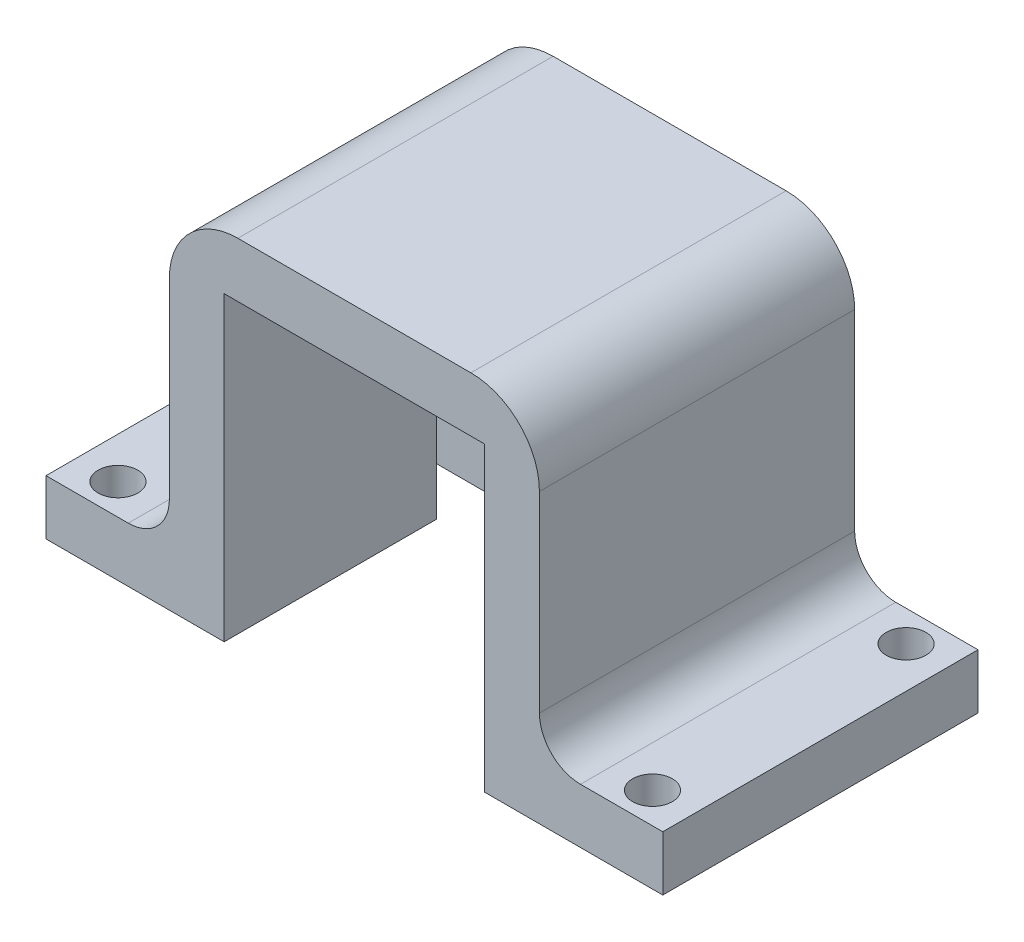
ISO-10303-21;
HEADER;
FILE_DESCRIPTION(('STEP AP214'),'2;1');
FILE_NAME('part.step','',(''),(''),'','','');
FILE_SCHEMA(('AUTOMOTIVE_DESIGN { 1 0 10303 214 1 1 1 1 }'));
ENDSEC;
DATA;
#1=APPLICATION_CONTEXT('core data for automotive mechanical design processes');
#2=APPLICATION_PROTOCOL_DEFINITION('international standard','automotive_design',2000,#1);
#3=PRODUCT_CONTEXT('',#1,'mechanical');
#4=PRODUCT('Part','Part','',(#3));
#5=PRODUCT_RELATED_PRODUCT_CATEGORY('part','',(#4));
#6=PRODUCT_DEFINITION_FORMATION('','',#4);
#7=PRODUCT_DEFINITION_CONTEXT('part definition',#1,'design');
#8=PRODUCT_DEFINITION('design','',#6,#7);
#9=PRODUCT_DEFINITION_SHAPE('','',#8);
#10=(LENGTH_UNIT() NAMED_UNIT(*) SI_UNIT(.MILLI.,.METRE.));
#11=(NAMED_UNIT(*) PLANE_ANGLE_UNIT() SI_UNIT($,.RADIAN.));
#12=(NAMED_UNIT(*) SI_UNIT($,.STERADIAN.) SOLID_ANGLE_UNIT());
#13=UNCERTAINTY_MEASURE_WITH_UNIT(LENGTH_MEASURE(1.E-05),#10,'distance_accuracy_value','');
#14=(GEOMETRIC_REPRESENTATION_CONTEXT(3) GLOBAL_UNCERTAINTY_ASSIGNED_CONTEXT((#13)) GLOBAL_UNIT_ASSIGNED_CONTEXT((#10,
#11,#12)) REPRESENTATION_CONTEXT('',''));
#15=CARTESIAN_POINT('',(0.,0.,0.));
#16=DIRECTION('',(0.,0.,1.));
#17=DIRECTION('',(1.,0.,0.));
#18=AXIS2_PLACEMENT_3D('',#15,#16,#17);
#19=CARTESIAN_POINT('',(0.,3.00000000000002,23.));
#20=DIRECTION('',(1.,0.,0.));
#21=DIRECTION('',(0.,0.,-1.));
#22=AXIS2_PLACEMENT_3D('',#19,#20,#21);
#23=PLANE('',#22);
#24=DIRECTION('',(0.,-1.,0.));
#25=VECTOR('',#24,1.);
#26=CARTESIAN_POINT('',(0.,3.00000000000002,4.));
#27=LINE('',#26,#25);
#28=CARTESIAN_POINT('',(0.,17.,4.));
#29=VERTEX_POINT('',#28);
#30=CARTESIAN_POINT('',(0.,3.00000000000002,4.));
#31=VERTEX_POINT('',#30);
#32=EDGE_CURVE('E413',#29,#31,#27,.T.);
#33=ORIENTED_EDGE('',*,*,#32,.F.);
#34=DIRECTION('',(0.,0.,-1.));
#35=VECTOR('',#34,1.);
#36=CARTESIAN_POINT('',(0.,17.,23.));
#37=LINE('',#36,#35);
#38=CARTESIAN_POINT('',(0.,17.,0.));
#39=VERTEX_POINT('',#38);
#40=EDGE_CURVE('E291',#29,#39,#37,.T.);
#41=ORIENTED_EDGE('',*,*,#40,.T.);
#42=DIRECTION('',(0.,-1.,0.));
#43=VECTOR('',#42,1.);
#44=CARTESIAN_POINT('',(0.,3.00000000000002,0.));
#45=LINE('',#44,#43);
#46=CARTESIAN_POINT('',(0.,3.00000000000002,0.));
#47=VERTEX_POINT('',#46);
#48=EDGE_CURVE('E229',#39,#47,#45,.T.);
#49=ORIENTED_EDGE('',*,*,#48,.T.);
#50=DIRECTION('',(0.,0.,-1.));
#51=VECTOR('',#50,1.);
#52=CARTESIAN_POINT('',(0.,3.00000000000002,23.));
#53=LINE('',#52,#51);
#54=EDGE_CURVE('E286',#31,#47,#53,.T.);
#55=ORIENTED_EDGE('',*,*,#54,.F.);
#56=EDGE_LOOP('',(#33,#41,#49,#55));
#57=FACE_BOUND('',#56,.T.);
#58=ADVANCED_FACE('F44',(#57),#23,.F.);
#59=DIRECTION('',(0.,1.,0.));
#60=VECTOR('',#59,1.);
#61=CARTESIAN_POINT('',(0.,3.00000000000002,7.5));
#62=LINE('',#61,#60);
#63=CARTESIAN_POINT('',(0.,3.00000000000002,7.5));
#64=VERTEX_POINT('',#63);
#65=CARTESIAN_POINT('',(0.,17.,7.5));
#66=VERTEX_POINT('',#65);
#67=EDGE_CURVE('E435',#64,#66,#62,.T.);
#68=ORIENTED_EDGE('',*,*,#67,.F.);
#69=CARTESIAN_POINT('',(0.,3.00000000000002,23.));
#70=VERTEX_POINT('',#69);
#71=EDGE_CURVE('E287',#70,#64,#53,.T.);
#72=ORIENTED_EDGE('',*,*,#71,.F.);
#73=DIRECTION('',(0.,-1.,0.));
#74=VECTOR('',#73,1.);
#75=CARTESIAN_POINT('',(0.,3.00000000000002,23.));
#76=LINE('',#75,#74);
#77=CARTESIAN_POINT('',(0.,17.,23.));
#78=VERTEX_POINT('',#77);
#79=EDGE_CURVE('E382',#78,#70,#76,.T.);
#80=ORIENTED_EDGE('',*,*,#79,.F.);
#81=EDGE_CURVE('E292',#78,#66,#37,.T.);
#82=ORIENTED_EDGE('',*,*,#81,.T.);
#83=EDGE_LOOP('',(#68,#72,#80,#82));
#84=FACE_BOUND('',#83,.T.);
#85=ADVANCED_FACE('F522',(#84),#23,.F.);
#86=CARTESIAN_POINT('',(-3.,3.,23.));
#87=DIRECTION('',(0.,0.,-1.));
#88=DIRECTION('',(-1.,0.,0.));
#89=AXIS2_PLACEMENT_3D('',#86,#87,#88);
#90=CYLINDRICAL_SURFACE('',#89,3.);
#91=CARTESIAN_POINT('',(-3.,3.,4.));
#92=DIRECTION('',(0.,0.,1.));
#93=DIRECTION('',(0.,-1.,0.));
#94=AXIS2_PLACEMENT_3D('',#91,#92,#93);
#95=CIRCLE('',#94,3.);
#96=CARTESIAN_POINT('',(-3.00000000000002,0.,4.));
#97=VERTEX_POINT('',#96);
#98=EDGE_CURVE('E423',#31,#97,#95,.F.);
#99=ORIENTED_EDGE('',*,*,#98,.F.);
#100=ORIENTED_EDGE('',*,*,#54,.T.);
#101=CARTESIAN_POINT('',(-3.,3.,0.));
#102=DIRECTION('',(0.,0.,-1.));
#103=DIRECTION('',(-1.,0.,0.));
#104=AXIS2_PLACEMENT_3D('',#101,#102,#103);
#105=CIRCLE('',#104,3.);
#106=CARTESIAN_POINT('',(-3.00000000000002,0.,0.));
#107=VERTEX_POINT('',#106);
#108=EDGE_CURVE('E233',#47,#107,#105,.T.);
#109=ORIENTED_EDGE('',*,*,#108,.T.);
#110=DIRECTION('',(0.,0.,-1.));
#111=VECTOR('',#110,1.);
#112=CARTESIAN_POINT('',(-3.00000000000002,0.,23.));
#113=LINE('',#112,#111);
#114=EDGE_CURVE('E281',#97,#107,#113,.T.);
#115=ORIENTED_EDGE('',*,*,#114,.F.);
#116=EDGE_LOOP('',(#99,#100,#109,#115));
#117=FACE_BOUND('',#116,.T.);
#118=ADVANCED_FACE('F500',(#117),#90,.F.);
#119=CARTESIAN_POINT('',(-3.,3.,7.5));
#120=DIRECTION('',(0.,0.,-1.));
#121=DIRECTION('',(0.,1.,0.));
#122=AXIS2_PLACEMENT_3D('',#119,#120,#121);
#123=CIRCLE('',#122,3.);
#124=CARTESIAN_POINT('',(-3.00000000000002,0.,7.5));
#125=VERTEX_POINT('',#124);
#126=EDGE_CURVE('E438',#125,#64,#123,.F.);
#127=ORIENTED_EDGE('',*,*,#126,.F.);
#128=CARTESIAN_POINT('',(-3.00000000000002,0.,23.));
#129=VERTEX_POINT('',#128);
#130=EDGE_CURVE('E282',#129,#125,#113,.T.);
#131=ORIENTED_EDGE('',*,*,#130,.F.);
#132=CARTESIAN_POINT('',(-3.,3.,23.));
#133=DIRECTION('',(0.,0.,-1.));
#134=DIRECTION('',(-1.,0.,0.));
#135=AXIS2_PLACEMENT_3D('',#132,#133,#134);
#136=CIRCLE('',#135,3.);
#137=EDGE_CURVE('E379',#70,#129,#136,.T.);
#138=ORIENTED_EDGE('',*,*,#137,.F.);
#139=ORIENTED_EDGE('',*,*,#71,.T.);
#140=EDGE_LOOP('',(#127,#131,#138,#139));
#141=FACE_BOUND('',#140,.T.);
#142=ADVANCED_FACE('F555',(#141),#90,.F.);
#143=CARTESIAN_POINT('',(-9.,0.,23.));
#144=DIRECTION('',(0.,-1.,0.));
#145=DIRECTION('',(0.,0.,-1.));
#146=AXIS2_PLACEMENT_3D('',#143,#144,#145);
#147=PLANE('',#146);
#148=CARTESIAN_POINT('',(-6.00000000000001,0.,2.25));
#149=DIRECTION('',(0.,1.,0.));
#150=DIRECTION('',(0.,0.,1.));
#151=AXIS2_PLACEMENT_3D('',#148,#149,#150);
#152=CIRCLE('',#151,1.45);
#153=CARTESIAN_POINT('',(-6.00000000000001,0.,3.7));
#154=VERTEX_POINT('',#153);
#155=EDGE_CURVE('E408',#154,#154,#152,.T.);
#156=ORIENTED_EDGE('',*,*,#155,.F.);
#157=EDGE_LOOP('',(#156));
#158=FACE_BOUND('',#157,.T.);
#159=DIRECTION('',(-1.,0.,0.));
#160=VECTOR('',#159,1.);
#161=CARTESIAN_POINT('',(-9.,0.,4.));
#162=LINE('',#161,#160);
#163=CARTESIAN_POINT('',(-9.,0.,4.));
#164=VERTEX_POINT('',#163);
#165=EDGE_CURVE('E427',#97,#164,#162,.T.);
#166=ORIENTED_EDGE('',*,*,#165,.F.);
#167=ORIENTED_EDGE('',*,*,#114,.T.);
#168=DIRECTION('',(-1.,0.,0.));
#169=VECTOR('',#168,1.);
#170=CARTESIAN_POINT('',(-9.,0.,0.));
#171=LINE('',#170,#169);
#172=CARTESIAN_POINT('',(-9.,0.,0.));
#173=VERTEX_POINT('',#172);
#174=EDGE_CURVE('E237',#107,#173,#171,.T.);
#175=ORIENTED_EDGE('',*,*,#174,.T.);
#176=DIRECTION('',(0.,0.,-1.));
#177=VECTOR('',#176,1.);
#178=CARTESIAN_POINT('',(-9.,0.,23.));
#179=LINE('',#178,#177);
#180=EDGE_CURVE('E276',#164,#173,#179,.T.);
#181=ORIENTED_EDGE('',*,*,#180,.F.);
#182=EDGE_LOOP('',(#166,#167,#175,#181));
#183=FACE_BOUND('',#182,.T.);
#184=ADVANCED_FACE('F552',(#158,#183),#147,.F.);
#185=CARTESIAN_POINT('',(-6.00000000000001,0.,20.75));
#186=DIRECTION('',(0.,1.,0.));
#187=DIRECTION('',(0.,0.,1.));
#188=AXIS2_PLACEMENT_3D('',#185,#186,#187);
#189=CIRCLE('',#188,1.45);
#190=CARTESIAN_POINT('',(-6.00000000000001,0.,22.2));
#191=VERTEX_POINT('',#190);
#192=EDGE_CURVE('E412',#191,#191,#189,.T.);
#193=ORIENTED_EDGE('',*,*,#192,.F.);
#194=EDGE_LOOP('',(#193));
#195=FACE_BOUND('',#194,.T.);
#196=DIRECTION('',(1.,0.,0.));
#197=VECTOR('',#196,1.);
#198=CARTESIAN_POINT('',(-9.,0.,7.5));
#199=LINE('',#198,#197);
#200=CARTESIAN_POINT('',(-9.,0.,7.5));
#201=VERTEX_POINT('',#200);
#202=EDGE_CURVE('E442',#201,#125,#199,.T.);
#203=ORIENTED_EDGE('',*,*,#202,.F.);
#204=CARTESIAN_POINT('',(-9.,0.,23.));
#205=VERTEX_POINT('',#204);
#206=EDGE_CURVE('E277',#205,#201,#179,.T.);
#207=ORIENTED_EDGE('',*,*,#206,.F.);
#208=DIRECTION('',(-1.,0.,0.));
#209=VECTOR('',#208,1.);
#210=CARTESIAN_POINT('',(-9.,0.,23.));
#211=LINE('',#210,#209);
#212=EDGE_CURVE('E376',#129,#205,#211,.T.);
#213=ORIENTED_EDGE('',*,*,#212,.F.);
#214=ORIENTED_EDGE('',*,*,#130,.T.);
#215=EDGE_LOOP('',(#203,#207,#213,#214));
#216=FACE_BOUND('',#215,.T.);
#217=ADVANCED_FACE('F554',(#195,#216),#147,.F.);
#218=CARTESIAN_POINT('',(-9.,-4.,23.));
#219=DIRECTION('',(1.,0.,0.));
#220=DIRECTION('',(0.,1.,0.));
#221=AXIS2_PLACEMENT_3D('',#218,#219,#220);
#222=PLANE('',#221);
#223=DIRECTION('',(0.,-1.,0.));
#224=VECTOR('',#223,1.);
#225=CARTESIAN_POINT('',(-9.,-4.,4.));
#226=LINE('',#225,#224);
#227=CARTESIAN_POINT('',(-9.,-4.,4.));
#228=VERTEX_POINT('',#227);
#229=EDGE_CURVE('E431',#164,#228,#226,.T.);
#230=ORIENTED_EDGE('',*,*,#229,.F.);
#231=ORIENTED_EDGE('',*,*,#180,.T.);
#232=DIRECTION('',(0.,-1.,0.));
#233=VECTOR('',#232,1.);
#234=CARTESIAN_POINT('',(-9.,-4.,0.));
#235=LINE('',#234,#233);
#236=CARTESIAN_POINT('',(-9.,-4.,0.));
#237=VERTEX_POINT('',#236);
#238=EDGE_CURVE('E241',#173,#237,#235,.T.);
#239=ORIENTED_EDGE('',*,*,#238,.T.);
#240=DIRECTION('',(0.,0.,-1.));
#241=VECTOR('',#240,1.);
#242=CARTESIAN_POINT('',(-9.,-4.,23.));
#243=LINE('',#242,#241);
#244=EDGE_CURVE('E271',#228,#237,#243,.T.);
#245=ORIENTED_EDGE('',*,*,#244,.F.);
#246=EDGE_LOOP('',(#230,#231,#239,#245));
#247=FACE_BOUND('',#246,.T.);
#248=ADVANCED_FACE('F549',(#247),#222,.F.);
#249=DIRECTION('',(0.,1.,0.));
#250=VECTOR('',#249,1.);
#251=CARTESIAN_POINT('',(-9.,-4.,7.5));
#252=LINE('',#251,#250);
#253=CARTESIAN_POINT('',(-9.,-4.,7.5));
#254=VERTEX_POINT('',#253);
#255=EDGE_CURVE('E446',#254,#201,#252,.T.);
#256=ORIENTED_EDGE('',*,*,#255,.F.);
#257=CARTESIAN_POINT('',(-9.,-4.,23.));
#258=VERTEX_POINT('',#257);
#259=EDGE_CURVE('E272',#258,#254,#243,.T.);
#260=ORIENTED_EDGE('',*,*,#259,.F.);
#261=DIRECTION('',(0.,-1.,0.));
#262=VECTOR('',#261,1.);
#263=CARTESIAN_POINT('',(-9.,-4.,23.));
#264=LINE('',#263,#262);
#265=EDGE_CURVE('E371',#205,#258,#264,.T.);
#266=ORIENTED_EDGE('',*,*,#265,.F.);
#267=ORIENTED_EDGE('',*,*,#206,.T.);
#268=EDGE_LOOP('',(#256,#260,#266,#267));
#269=FACE_BOUND('',#268,.T.);
#270=ADVANCED_FACE('F617',(#269),#222,.F.);
#271=CARTESIAN_POINT('',(4.,-4.,23.));
#272=DIRECTION('',(0.,1.,0.));
#273=DIRECTION('',(-1.,0.,0.));
#274=AXIS2_PLACEMENT_3D('',#271,#272,#273);
#275=PLANE('',#274);
#276=CARTESIAN_POINT('',(-6.00000000000001,-4.,2.25));
#277=DIRECTION('',(0.,1.,0.));
#278=DIRECTION('',(-1.,0.,0.));
#279=AXIS2_PLACEMENT_3D('',#276,#277,#278);
#280=CIRCLE('',#279,1.45);
#281=CARTESIAN_POINT('',(-7.45000000000001,-4.,2.25));
#282=VERTEX_POINT('',#281);
#283=EDGE_CURVE('E210',#282,#282,#280,.T.);
#284=ORIENTED_EDGE('',*,*,#283,.T.);
#285=EDGE_LOOP('',(#284));
#286=FACE_BOUND('',#285,.T.);
#287=DIRECTION('',(1.,0.,0.));
#288=VECTOR('',#287,1.);
#289=CARTESIAN_POINT('',(-23.,-4.,4.));
#290=LINE('',#289,#288);
#291=CARTESIAN_POINT('',(4.,-4.,4.));
#292=VERTEX_POINT('',#291);
#293=EDGE_CURVE('E364',#228,#292,#290,.T.);
#294=ORIENTED_EDGE('',*,*,#293,.F.);
#295=ORIENTED_EDGE('',*,*,#244,.T.);
#296=DIRECTION('',(1.,0.,0.));
#297=VECTOR('',#296,1.);
#298=CARTESIAN_POINT('',(4.,-4.,0.));
#299=LINE('',#298,#297);
#300=CARTESIAN_POINT('',(4.,-4.,0.));
#301=VERTEX_POINT('',#300);
#302=EDGE_CURVE('E245',#237,#301,#299,.T.);
#303=ORIENTED_EDGE('',*,*,#302,.T.);
#304=DIRECTION('',(0.,0.,-1.));
#305=VECTOR('',#304,1.);
#306=CARTESIAN_POINT('',(4.,-4.,23.));
#307=LINE('',#306,#305);
#308=EDGE_CURVE('E266',#292,#301,#307,.T.);
#309=ORIENTED_EDGE('',*,*,#308,.F.);
#310=EDGE_LOOP('',(#294,#295,#303,#309));
#311=FACE_BOUND('',#310,.T.);
#312=ADVANCED_FACE('F469',(#286,#311),#275,.F.);
#313=CARTESIAN_POINT('',(-6.00000000000001,-4.,20.75));
#314=DIRECTION('',(0.,1.,0.));
#315=DIRECTION('',(-1.,0.,0.));
#316=AXIS2_PLACEMENT_3D('',#313,#314,#315);
#317=CIRCLE('',#316,1.45);
#318=CARTESIAN_POINT('',(-7.45000000000001,-4.,20.75));
#319=VERTEX_POINT('',#318);
#320=EDGE_CURVE('E329',#319,#319,#317,.T.);
#321=ORIENTED_EDGE('',*,*,#320,.T.);
#322=EDGE_LOOP('',(#321));
#323=FACE_BOUND('',#322,.T.);
#324=DIRECTION('',(1.,0.,0.));
#325=VECTOR('',#324,1.);
#326=CARTESIAN_POINT('',(-23.,-4.,7.5));
#327=LINE('',#326,#325);
#328=CARTESIAN_POINT('',(4.,-4.,7.5));
#329=VERTEX_POINT('',#328);
#330=EDGE_CURVE('E349',#254,#329,#327,.T.);
#331=ORIENTED_EDGE('',*,*,#330,.T.);
#332=CARTESIAN_POINT('',(4.,-4.,23.));
#333=VERTEX_POINT('',#332);
#334=EDGE_CURVE('E267',#333,#329,#307,.T.);
#335=ORIENTED_EDGE('',*,*,#334,.F.);
#336=DIRECTION('',(1.,0.,0.));
#337=VECTOR('',#336,1.);
#338=CARTESIAN_POINT('',(4.,-4.,23.));
#339=LINE('',#338,#337);
#340=EDGE_CURVE('E369',#258,#333,#339,.T.);
#341=ORIENTED_EDGE('',*,*,#340,.F.);
#342=ORIENTED_EDGE('',*,*,#259,.T.);
#343=EDGE_LOOP('',(#331,#335,#341,#342));
#344=FACE_BOUND('',#343,.T.);
#345=ADVANCED_FACE('F360',(#323,#344),#275,.F.);
#346=CARTESIAN_POINT('',(4.,18.,23.));
#347=DIRECTION('',(-1.,0.,0.));
#348=DIRECTION('',(0.,-1.,0.));
#349=AXIS2_PLACEMENT_3D('',#346,#347,#348);
#350=PLANE('',#349);
#351=DIRECTION('',(0.,1.,0.));
#352=VECTOR('',#351,1.);
#353=CARTESIAN_POINT('',(4.,18.,4.));
#354=LINE('',#353,#352);
#355=CARTESIAN_POINT('',(4.,17.,4.));
#356=VERTEX_POINT('',#355);
#357=EDGE_CURVE('E11',#292,#356,#354,.T.);
#358=ORIENTED_EDGE('',*,*,#357,.F.);
#359=ORIENTED_EDGE('',*,*,#308,.T.);
#360=DIRECTION('',(0.,1.,0.));
#361=VECTOR('',#360,1.);
#362=CARTESIAN_POINT('',(4.,18.,0.));
#363=LINE('',#362,#361);
#364=CARTESIAN_POINT('',(4.,18.,0.));
#365=VERTEX_POINT('',#364);
#366=EDGE_CURVE('E249',#301,#365,#363,.T.);
#367=ORIENTED_EDGE('',*,*,#366,.T.);
#368=DIRECTION('',(0.,0.,-1.));
#369=VECTOR('',#368,1.);
#370=CARTESIAN_POINT('',(4.,18.,23.));
#371=LINE('',#370,#369);
#372=CARTESIAN_POINT('',(4.,18.,23.));
#373=VERTEX_POINT('',#372);
#374=EDGE_CURVE('E194',#373,#365,#371,.T.);
#375=ORIENTED_EDGE('',*,*,#374,.F.);
#376=DIRECTION('',(0.,1.,0.));
#377=VECTOR('',#376,1.);
#378=CARTESIAN_POINT('',(4.,18.,23.));
#379=LINE('',#378,#377);
#380=EDGE_CURVE('E180',#333,#373,#379,.T.);
#381=ORIENTED_EDGE('',*,*,#380,.F.);
#382=ORIENTED_EDGE('',*,*,#334,.T.);
#383=DIRECTION('',(0.,-1.,0.));
#384=VECTOR('',#383,1.);
#385=CARTESIAN_POINT('',(4.,18.,7.5));
#386=LINE('',#385,#384);
#387=CARTESIAN_POINT('',(4.,17.,7.5));
#388=VERTEX_POINT('',#387);
#389=EDGE_CURVE('E53',#388,#329,#386,.T.);
#390=ORIENTED_EDGE('',*,*,#389,.F.);
#391=DIRECTION('',(0.,0.,1.));
#392=VECTOR('',#391,1.);
#393=CARTESIAN_POINT('',(4.,17.,23.));
#394=LINE('',#393,#392);
#395=EDGE_CURVE('E319',#356,#388,#394,.T.);
#396=ORIENTED_EDGE('',*,*,#395,.F.);
#397=EDGE_LOOP('',(#358,#359,#367,#375,#381,#382,#390,#396));
#398=FACE_BOUND('',#397,.T.);
#399=ADVANCED_FACE('F367',(#398),#350,.F.);
#400=CARTESIAN_POINT('',(36.,0.,23.));
#401=DIRECTION('',(-1.,0.,0.));
#402=DIRECTION('',(0.,0.,1.));
#403=AXIS2_PLACEMENT_3D('',#400,#401,#402);
#404=PLANE('',#403);
#405=DIRECTION('',(0.,1.,0.));
#406=VECTOR('',#405,1.);
#407=CARTESIAN_POINT('',(36.,0.,0.));
#408=LINE('',#407,#406);
#409=CARTESIAN_POINT('',(36.,-4.,0.));
#410=VERTEX_POINT('',#409);
#411=CARTESIAN_POINT('',(36.,0.,0.));
#412=VERTEX_POINT('',#411);
#413=EDGE_CURVE('E205',#410,#412,#408,.T.);
#414=ORIENTED_EDGE('',*,*,#413,.T.);
#415=DIRECTION('',(0.,0.,-1.));
#416=VECTOR('',#415,1.);
#417=CARTESIAN_POINT('',(36.,0.,23.));
#418=LINE('',#417,#416);
#419=CARTESIAN_POINT('',(36.,0.,23.));
#420=VERTEX_POINT('',#419);
#421=EDGE_CURVE('E316',#420,#412,#418,.T.);
#422=ORIENTED_EDGE('',*,*,#421,.F.);
#423=DIRECTION('',(0.,1.,0.));
#424=VECTOR('',#423,1.);
#425=CARTESIAN_POINT('',(36.,0.,23.));
#426=LINE('',#425,#424);
#427=CARTESIAN_POINT('',(36.,-4.,23.));
#428=VERTEX_POINT('',#427);
#429=EDGE_CURVE('E259',#428,#420,#426,.T.);
#430=ORIENTED_EDGE('',*,*,#429,.F.);
#431=DIRECTION('',(0.,0.,-1.));
#432=VECTOR('',#431,1.);
#433=CARTESIAN_POINT('',(36.,-4.,23.));
#434=LINE('',#433,#432);
#435=EDGE_CURVE('E201',#428,#410,#434,.T.);
#436=ORIENTED_EDGE('',*,*,#435,.T.);
#437=EDGE_LOOP('',(#414,#422,#430,#436));
#438=FACE_BOUND('',#437,.T.);
#439=ADVANCED_FACE('F46',(#438),#404,.F.);
#440=CARTESIAN_POINT('',(30.,0.,23.));
#441=DIRECTION('',(0.,-1.,0.));
#442=DIRECTION('',(0.,0.,-1.));
#443=AXIS2_PLACEMENT_3D('',#440,#441,#442);
#444=PLANE('',#443);
#445=CARTESIAN_POINT('',(33.,0.,20.75));
#446=DIRECTION('',(0.,-1.,0.));
#447=DIRECTION('',(0.,0.,-1.));
#448=AXIS2_PLACEMENT_3D('',#445,#446,#447);
#449=CIRCLE('',#448,1.45);
#450=CARTESIAN_POINT('',(33.,0.,19.3));
#451=VERTEX_POINT('',#450);
#452=EDGE_CURVE('E407',#451,#451,#449,.T.);
#453=ORIENTED_EDGE('',*,*,#452,.T.);
#454=EDGE_LOOP('',(#453));
#455=FACE_BOUND('',#454,.T.);
#456=CARTESIAN_POINT('',(33.,0.,2.25));
#457=DIRECTION('',(0.,-1.,0.));
#458=DIRECTION('',(0.,0.,-1.));
#459=AXIS2_PLACEMENT_3D('',#456,#457,#458);
#460=CIRCLE('',#459,1.45);
#461=CARTESIAN_POINT('',(33.,0.,0.799999999999999));
#462=VERTEX_POINT('',#461);
#463=EDGE_CURVE('E325',#462,#462,#460,.T.);
#464=ORIENTED_EDGE('',*,*,#463,.T.);
#465=EDGE_LOOP('',(#464));
#466=FACE_BOUND('',#465,.T.);
#467=DIRECTION('',(-1.,0.,0.));
#468=VECTOR('',#467,1.);
#469=CARTESIAN_POINT('',(30.,0.,0.));
#470=LINE('',#469,#468);
#471=CARTESIAN_POINT('',(30.,0.,0.));
#472=VERTEX_POINT('',#471);
#473=EDGE_CURVE('E209',#412,#472,#470,.T.);
#474=ORIENTED_EDGE('',*,*,#473,.T.);
#475=DIRECTION('',(0.,0.,-1.));
#476=VECTOR('',#475,1.);
#477=CARTESIAN_POINT('',(30.,0.,23.));
#478=LINE('',#477,#476);
#479=CARTESIAN_POINT('',(30.,0.,23.));
#480=VERTEX_POINT('',#479);
#481=EDGE_CURVE('E312',#480,#472,#478,.T.);
#482=ORIENTED_EDGE('',*,*,#481,.F.);
#483=DIRECTION('',(-1.,0.,0.));
#484=VECTOR('',#483,1.);
#485=CARTESIAN_POINT('',(30.,0.,23.));
#486=LINE('',#485,#484);
#487=EDGE_CURVE('E134',#420,#480,#486,.T.);
#488=ORIENTED_EDGE('',*,*,#487,.F.);
#489=ORIENTED_EDGE('',*,*,#421,.T.);
#490=EDGE_LOOP('',(#474,#482,#488,#489));
#491=FACE_BOUND('',#490,.T.);
#492=ADVANCED_FACE('F544',(#455,#466,#491),#444,.F.);
#493=CARTESIAN_POINT('',(30.,3.,23.));
#494=DIRECTION('',(0.,0.,-1.));
#495=DIRECTION('',(-1.,0.,0.));
#496=AXIS2_PLACEMENT_3D('',#493,#494,#495);
#497=CYLINDRICAL_SURFACE('',#496,3.);
#498=CARTESIAN_POINT('',(30.,3.,0.));
#499=DIRECTION('',(0.,0.,-1.));
#500=DIRECTION('',(-1.,0.,0.));
#501=AXIS2_PLACEMENT_3D('',#498,#499,#500);
#502=CIRCLE('',#501,3.);
#503=CARTESIAN_POINT('',(27.,3.,0.));
#504=VERTEX_POINT('',#503);
#505=EDGE_CURVE('E213',#472,#504,#502,.T.);
#506=ORIENTED_EDGE('',*,*,#505,.T.);
#507=DIRECTION('',(0.,0.,-1.));
#508=VECTOR('',#507,1.);
#509=CARTESIAN_POINT('',(27.,3.,23.));
#510=LINE('',#509,#508);
#511=CARTESIAN_POINT('',(27.,3.,23.));
#512=VERTEX_POINT('',#511);
#513=EDGE_CURVE('E308',#512,#504,#510,.T.);
#514=ORIENTED_EDGE('',*,*,#513,.F.);
#515=CARTESIAN_POINT('',(30.,3.,23.));
#516=DIRECTION('',(0.,0.,-1.));
#517=DIRECTION('',(-1.,0.,0.));
#518=AXIS2_PLACEMENT_3D('',#515,#516,#517);
#519=CIRCLE('',#518,3.);
#520=EDGE_CURVE('E397',#480,#512,#519,.T.);
#521=ORIENTED_EDGE('',*,*,#520,.F.);
#522=ORIENTED_EDGE('',*,*,#481,.T.);
#523=EDGE_LOOP('',(#506,#514,#521,#522));
#524=FACE_BOUND('',#523,.T.);
#525=ADVANCED_FACE('F542',(#524),#497,.F.);
#526=CARTESIAN_POINT('',(27.,17.,23.));
#527=DIRECTION('',(-1.,0.,0.));
#528=DIRECTION('',(0.,-1.,0.));
#529=AXIS2_PLACEMENT_3D('',#526,#527,#528);
#530=PLANE('',#529);
#531=DIRECTION('',(0.,1.,0.));
#532=VECTOR('',#531,1.);
#533=CARTESIAN_POINT('',(27.,17.,0.));
#534=LINE('',#533,#532);
#535=CARTESIAN_POINT('',(27.,17.,0.));
#536=VERTEX_POINT('',#535);
#537=EDGE_CURVE('E216',#504,#536,#534,.T.);
#538=ORIENTED_EDGE('',*,*,#537,.T.);
#539=DIRECTION('',(0.,0.,-1.));
#540=VECTOR('',#539,1.);
#541=CARTESIAN_POINT('',(27.,17.,23.));
#542=LINE('',#541,#540);
#543=CARTESIAN_POINT('',(27.,17.,23.));
#544=VERTEX_POINT('',#543);
#545=EDGE_CURVE('E304',#544,#536,#542,.T.);
#546=ORIENTED_EDGE('',*,*,#545,.F.);
#547=DIRECTION('',(0.,1.,0.));
#548=VECTOR('',#547,1.);
#549=CARTESIAN_POINT('',(27.,17.,23.));
#550=LINE('',#549,#548);
#551=EDGE_CURVE('E394',#512,#544,#550,.T.);
#552=ORIENTED_EDGE('',*,*,#551,.F.);
#553=ORIENTED_EDGE('',*,*,#513,.T.);
#554=EDGE_LOOP('',(#538,#546,#552,#553));
#555=FACE_BOUND('',#554,.T.);
#556=ADVANCED_FACE('F538',(#555),#530,.F.);
#557=CARTESIAN_POINT('',(22.,17.,23.));
#558=DIRECTION('',(0.,0.,-1.));
#559=DIRECTION('',(-1.,0.,0.));
#560=AXIS2_PLACEMENT_3D('',#557,#558,#559);
#561=CYLINDRICAL_SURFACE('',#560,5.);
#562=CARTESIAN_POINT('',(22.,17.,0.));
#563=DIRECTION('',(0.,0.,1.));
#564=DIRECTION('',(-1.,0.,0.));
#565=AXIS2_PLACEMENT_3D('',#562,#563,#564);
#566=CIRCLE('',#565,5.);
#567=CARTESIAN_POINT('',(22.,22.,0.));
#568=VERTEX_POINT('',#567);
#569=EDGE_CURVE('E219',#536,#568,#566,.T.);
#570=ORIENTED_EDGE('',*,*,#569,.T.);
#571=DIRECTION('',(0.,0.,-1.));
#572=VECTOR('',#571,1.);
#573=CARTESIAN_POINT('',(22.,22.,23.));
#574=LINE('',#573,#572);
#575=CARTESIAN_POINT('',(22.,22.,23.));
#576=VERTEX_POINT('',#575);
#577=EDGE_CURVE('E300',#576,#568,#574,.T.);
#578=ORIENTED_EDGE('',*,*,#577,.F.);
#579=CARTESIAN_POINT('',(22.,17.,23.));
#580=DIRECTION('',(0.,0.,1.));
#581=DIRECTION('',(-1.,0.,0.));
#582=AXIS2_PLACEMENT_3D('',#579,#580,#581);
#583=CIRCLE('',#582,5.);
#584=EDGE_CURVE('E391',#544,#576,#583,.T.);
#585=ORIENTED_EDGE('',*,*,#584,.F.);
#586=ORIENTED_EDGE('',*,*,#545,.T.);
#587=EDGE_LOOP('',(#570,#578,#585,#586));
#588=FACE_BOUND('',#587,.T.);
#589=ADVANCED_FACE('F534',(#588),#561,.T.);
#590=CARTESIAN_POINT('',(5.00000000000004,22.,23.));
#591=DIRECTION('',(0.,-1.,0.));
#592=DIRECTION('',(0.,0.,-1.));
#593=AXIS2_PLACEMENT_3D('',#590,#591,#592);
#594=PLANE('',#593);
#595=DIRECTION('',(-1.,0.,0.));
#596=VECTOR('',#595,1.);
#597=CARTESIAN_POINT('',(5.00000000000004,22.,0.));
#598=LINE('',#597,#596);
#599=CARTESIAN_POINT('',(5.00000000000004,22.,0.));
#600=VERTEX_POINT('',#599);
#601=EDGE_CURVE('E222',#568,#600,#598,.T.);
#602=ORIENTED_EDGE('',*,*,#601,.T.);
#603=DIRECTION('',(0.,0.,-1.));
#604=VECTOR('',#603,1.);
#605=CARTESIAN_POINT('',(5.00000000000004,22.,23.));
#606=LINE('',#605,#604);
#607=CARTESIAN_POINT('',(5.00000000000004,22.,23.));
#608=VERTEX_POINT('',#607);
#609=EDGE_CURVE('E296',#608,#600,#606,.T.);
#610=ORIENTED_EDGE('',*,*,#609,.F.);
#611=DIRECTION('',(-1.,0.,0.));
#612=VECTOR('',#611,1.);
#613=CARTESIAN_POINT('',(5.00000000000004,22.,23.));
#614=LINE('',#613,#612);
#615=EDGE_CURVE('E388',#576,#608,#614,.T.);
#616=ORIENTED_EDGE('',*,*,#615,.F.);
#617=ORIENTED_EDGE('',*,*,#577,.T.);
#618=EDGE_LOOP('',(#602,#610,#616,#617));
#619=FACE_BOUND('',#618,.T.);
#620=ADVANCED_FACE('F529',(#619),#594,.F.);
#621=CARTESIAN_POINT('',(5.,17.,23.));
#622=DIRECTION('',(0.,0.,-1.));
#623=DIRECTION('',(-1.,0.,0.));
#624=AXIS2_PLACEMENT_3D('',#621,#622,#623);
#625=CYLINDRICAL_SURFACE('',#624,5.);
#626=CARTESIAN_POINT('',(5.,17.,0.));
#627=DIRECTION('',(0.,0.,1.));
#628=DIRECTION('',(1.,0.,0.));
#629=AXIS2_PLACEMENT_3D('',#626,#627,#628);
#630=CIRCLE('',#629,5.);
#631=EDGE_CURVE('E225',#600,#39,#630,.T.);
#632=ORIENTED_EDGE('',*,*,#631,.T.);
#633=ORIENTED_EDGE('',*,*,#40,.F.);
#634=DIRECTION('',(0.,0.,-1.));
#635=VECTOR('',#634,1.);
#636=CARTESIAN_POINT('',(0.,17.,23.));
#637=LINE('',#636,#635);
#638=EDGE_CURVE('E449',#66,#29,#637,.T.);
#639=ORIENTED_EDGE('',*,*,#638,.F.);
#640=ORIENTED_EDGE('',*,*,#81,.F.);
#641=CARTESIAN_POINT('',(5.,17.,23.));
#642=DIRECTION('',(0.,0.,1.));
#643=DIRECTION('',(1.,0.,0.));
#644=AXIS2_PLACEMENT_3D('',#641,#642,#643);
#645=CIRCLE('',#644,5.);
#646=EDGE_CURVE('E385',#608,#78,#645,.T.);
#647=ORIENTED_EDGE('',*,*,#646,.F.);
#648=ORIENTED_EDGE('',*,*,#609,.T.);
#649=EDGE_LOOP('',(#632,#633,#639,#640,#647,#648));
#650=FACE_BOUND('',#649,.T.);
#651=ADVANCED_FACE('F488',(#650),#625,.T.);
#652=CARTESIAN_POINT('',(23.,18.,23.));
#653=DIRECTION('',(0.,1.,0.));
#654=DIRECTION('',(-1.,0.,0.));
#655=AXIS2_PLACEMENT_3D('',#652,#653,#654);
#656=PLANE('',#655);
#657=DIRECTION('',(1.,0.,0.));
#658=VECTOR('',#657,1.);
#659=CARTESIAN_POINT('',(23.,18.,0.));
#660=LINE('',#659,#658);
#661=CARTESIAN_POINT('',(23.,18.,0.));
#662=VERTEX_POINT('',#661);
#663=EDGE_CURVE('E190',#365,#662,#660,.T.);
#664=ORIENTED_EDGE('',*,*,#663,.T.);
#665=DIRECTION('',(0.,0.,-1.));
#666=VECTOR('',#665,1.);
#667=CARTESIAN_POINT('',(23.,18.,23.));
#668=LINE('',#667,#666);
#669=CARTESIAN_POINT('',(23.,18.,23.));
#670=VERTEX_POINT('',#669);
#671=EDGE_CURVE('E187',#670,#662,#668,.T.);
#672=ORIENTED_EDGE('',*,*,#671,.F.);
#673=DIRECTION('',(1.,0.,0.));
#674=VECTOR('',#673,1.);
#675=CARTESIAN_POINT('',(23.,18.,23.));
#676=LINE('',#675,#674);
#677=EDGE_CURVE('E173',#373,#670,#676,.T.);
#678=ORIENTED_EDGE('',*,*,#677,.F.);
#679=ORIENTED_EDGE('',*,*,#374,.T.);
#680=EDGE_LOOP('',(#664,#672,#678,#679));
#681=FACE_BOUND('',#680,.T.);
#682=ADVANCED_FACE('F188',(#681),#656,.F.);
#683=CARTESIAN_POINT('',(23.,-4.,23.));
#684=DIRECTION('',(1.,0.,0.));
#685=DIRECTION('',(0.,0.,-1.));
#686=AXIS2_PLACEMENT_3D('',#683,#684,#685);
#687=PLANE('',#686);
#688=DIRECTION('',(0.,-1.,0.));
#689=VECTOR('',#688,1.);
#690=CARTESIAN_POINT('',(23.,-4.,0.));
#691=LINE('',#690,#689);
#692=CARTESIAN_POINT('',(23.,-4.,0.));
#693=VERTEX_POINT('',#692);
#694=EDGE_CURVE('E254',#662,#693,#691,.T.);
#695=ORIENTED_EDGE('',*,*,#694,.T.);
#696=DIRECTION('',(0.,0.,-1.));
#697=VECTOR('',#696,1.);
#698=CARTESIAN_POINT('',(23.,-4.,23.));
#699=LINE('',#698,#697);
#700=CARTESIAN_POINT('',(23.,-4.,23.));
#701=VERTEX_POINT('',#700);
#702=EDGE_CURVE('E195',#701,#693,#699,.T.);
#703=ORIENTED_EDGE('',*,*,#702,.F.);
#704=DIRECTION('',(0.,-1.,0.));
#705=VECTOR('',#704,1.);
#706=CARTESIAN_POINT('',(23.,-4.,23.));
#707=LINE('',#706,#705);
#708=EDGE_CURVE('E177',#670,#701,#707,.T.);
#709=ORIENTED_EDGE('',*,*,#708,.F.);
#710=ORIENTED_EDGE('',*,*,#671,.T.);
#711=EDGE_LOOP('',(#695,#703,#709,#710));
#712=FACE_BOUND('',#711,.T.);
#713=ADVANCED_FACE('F197',(#712),#687,.F.);
#714=CARTESIAN_POINT('',(36.,-4.,23.));
#715=DIRECTION('',(0.,1.,0.));
#716=DIRECTION('',(-1.,0.,0.));
#717=AXIS2_PLACEMENT_3D('',#714,#715,#716);
#718=PLANE('',#717);
#719=CARTESIAN_POINT('',(33.,-4.,20.75));
#720=DIRECTION('',(0.,1.,0.));
#721=DIRECTION('',(-1.,0.,0.));
#722=AXIS2_PLACEMENT_3D('',#719,#720,#721);
#723=CIRCLE('',#722,1.45);
#724=CARTESIAN_POINT('',(31.55,-4.,20.75));
#725=VERTEX_POINT('',#724);
#726=EDGE_CURVE('E324',#725,#725,#723,.F.);
#727=ORIENTED_EDGE('',*,*,#726,.F.);
#728=EDGE_LOOP('',(#727));
#729=FACE_BOUND('',#728,.T.);
#730=CARTESIAN_POINT('',(33.,-4.,2.25));
#731=DIRECTION('',(0.,1.,0.));
#732=DIRECTION('',(-1.,0.,0.));
#733=AXIS2_PLACEMENT_3D('',#730,#731,#732);
#734=CIRCLE('',#733,1.45);
#735=CARTESIAN_POINT('',(31.55,-4.,2.25));
#736=VERTEX_POINT('',#735);
#737=EDGE_CURVE('E320',#736,#736,#734,.F.);
#738=ORIENTED_EDGE('',*,*,#737,.F.);
#739=EDGE_LOOP('',(#738));
#740=FACE_BOUND('',#739,.T.);
#741=DIRECTION('',(1.,0.,0.));
#742=VECTOR('',#741,1.);
#743=CARTESIAN_POINT('',(36.,-4.,0.));
#744=LINE('',#743,#742);
#745=EDGE_CURVE('E125',#693,#410,#744,.T.);
#746=ORIENTED_EDGE('',*,*,#745,.T.);
#747=ORIENTED_EDGE('',*,*,#435,.F.);
#748=DIRECTION('',(1.,0.,0.));
#749=VECTOR('',#748,1.);
#750=CARTESIAN_POINT('',(36.,-4.,23.));
#751=LINE('',#750,#749);
#752=EDGE_CURVE('E68',#701,#428,#751,.T.);
#753=ORIENTED_EDGE('',*,*,#752,.F.);
#754=ORIENTED_EDGE('',*,*,#702,.T.);
#755=EDGE_LOOP('',(#746,#747,#753,#754));
#756=FACE_BOUND('',#755,.T.);
#757=ADVANCED_FACE('F547',(#729,#740,#756),#718,.F.);
#758=CARTESIAN_POINT('',(-3.,3.,23.));
#759=DIRECTION('',(0.,0.,-1.));
#760=DIRECTION('',(-1.,0.,0.));
#761=AXIS2_PLACEMENT_3D('',#758,#759,#760);
#762=PLANE('',#761);
#763=ORIENTED_EDGE('',*,*,#429,.T.);
#764=ORIENTED_EDGE('',*,*,#487,.T.);
#765=ORIENTED_EDGE('',*,*,#520,.T.);
#766=ORIENTED_EDGE('',*,*,#551,.T.);
#767=ORIENTED_EDGE('',*,*,#584,.T.);
#768=ORIENTED_EDGE('',*,*,#615,.T.);
#769=ORIENTED_EDGE('',*,*,#646,.T.);
#770=ORIENTED_EDGE('',*,*,#79,.T.);
#771=ORIENTED_EDGE('',*,*,#137,.T.);
#772=ORIENTED_EDGE('',*,*,#212,.T.);
#773=ORIENTED_EDGE('',*,*,#265,.T.);
#774=ORIENTED_EDGE('',*,*,#340,.T.);
#775=ORIENTED_EDGE('',*,*,#380,.T.);
#776=ORIENTED_EDGE('',*,*,#677,.T.);
#777=ORIENTED_EDGE('',*,*,#708,.T.);
#778=ORIENTED_EDGE('',*,*,#752,.T.);
#779=EDGE_LOOP('',(#763,#764,#765,#766,#767,#768,#769,#770,#771,#772,#773,#774,#775,#776,#777,#778));
#780=FACE_BOUND('',#779,.T.);
#781=ADVANCED_FACE('F175',(#780),#762,.F.);
#782=CARTESIAN_POINT('',(-3.,3.,0.));
#783=DIRECTION('',(0.,0.,-1.));
#784=DIRECTION('',(-1.,0.,0.));
#785=AXIS2_PLACEMENT_3D('',#782,#783,#784);
#786=PLANE('',#785);
#787=ORIENTED_EDGE('',*,*,#413,.F.);
#788=ORIENTED_EDGE('',*,*,#745,.F.);
#789=ORIENTED_EDGE('',*,*,#694,.F.);
#790=ORIENTED_EDGE('',*,*,#663,.F.);
#791=ORIENTED_EDGE('',*,*,#366,.F.);
#792=ORIENTED_EDGE('',*,*,#302,.F.);
#793=ORIENTED_EDGE('',*,*,#238,.F.);
#794=ORIENTED_EDGE('',*,*,#174,.F.);
#795=ORIENTED_EDGE('',*,*,#108,.F.);
#796=ORIENTED_EDGE('',*,*,#48,.F.);
#797=ORIENTED_EDGE('',*,*,#631,.F.);
#798=ORIENTED_EDGE('',*,*,#601,.F.);
#799=ORIENTED_EDGE('',*,*,#569,.F.);
#800=ORIENTED_EDGE('',*,*,#537,.F.);
#801=ORIENTED_EDGE('',*,*,#505,.F.);
#802=ORIENTED_EDGE('',*,*,#473,.F.);
#803=EDGE_LOOP('',(#787,#788,#789,#790,#791,#792,#793,#794,#795,#796,#797,#798,#799,#800,#801,#802));
#804=FACE_BOUND('',#803,.T.);
#805=ADVANCED_FACE('F494',(#804),#786,.T.);
#806=CARTESIAN_POINT('',(33.,-23.,2.25));
#807=DIRECTION('',(0.,1.,0.));
#808=DIRECTION('',(0.,0.,1.));
#809=AXIS2_PLACEMENT_3D('',#806,#807,#808);
#810=CYLINDRICAL_SURFACE('',#809,1.45);
#811=ORIENTED_EDGE('',*,*,#463,.F.);
#812=EDGE_LOOP('',(#811));
#813=FACE_BOUND('',#812,.T.);
#814=ORIENTED_EDGE('',*,*,#737,.T.);
#815=EDGE_LOOP('',(#814));
#816=FACE_BOUND('',#815,.T.);
#817=ADVANCED_FACE('F594',(#813,#816),#810,.F.);
#818=CARTESIAN_POINT('',(33.,-23.,20.75));
#819=DIRECTION('',(0.,1.,0.));
#820=DIRECTION('',(0.,0.,1.));
#821=AXIS2_PLACEMENT_3D('',#818,#819,#820);
#822=CYLINDRICAL_SURFACE('',#821,1.45);
#823=ORIENTED_EDGE('',*,*,#452,.F.);
#824=EDGE_LOOP('',(#823));
#825=FACE_BOUND('',#824,.T.);
#826=ORIENTED_EDGE('',*,*,#726,.T.);
#827=EDGE_LOOP('',(#826));
#828=FACE_BOUND('',#827,.T.);
#829=ADVANCED_FACE('F597',(#825,#828),#822,.F.);
#830=CARTESIAN_POINT('',(-6.00000000000001,-23.,20.75));
#831=DIRECTION('',(0.,1.,0.));
#832=DIRECTION('',(0.,0.,1.));
#833=AXIS2_PLACEMENT_3D('',#830,#831,#832);
#834=CYLINDRICAL_SURFACE('',#833,1.45);
#835=ORIENTED_EDGE('',*,*,#192,.T.);
#836=EDGE_LOOP('',(#835));
#837=FACE_BOUND('',#836,.T.);
#838=ORIENTED_EDGE('',*,*,#320,.F.);
#839=EDGE_LOOP('',(#838));
#840=FACE_BOUND('',#839,.T.);
#841=ADVANCED_FACE('F729',(#837,#840),#834,.F.);
#842=CARTESIAN_POINT('',(-6.00000000000001,-23.,2.25));
#843=DIRECTION('',(0.,1.,0.));
#844=DIRECTION('',(0.,0.,1.));
#845=AXIS2_PLACEMENT_3D('',#842,#843,#844);
#846=CYLINDRICAL_SURFACE('',#845,1.45);
#847=ORIENTED_EDGE('',*,*,#155,.T.);
#848=EDGE_LOOP('',(#847));
#849=FACE_BOUND('',#848,.T.);
#850=ORIENTED_EDGE('',*,*,#283,.F.);
#851=EDGE_LOOP('',(#850));
#852=FACE_BOUND('',#851,.T.);
#853=ADVANCED_FACE('F659',(#849,#852),#846,.F.);
#854=CARTESIAN_POINT('',(-23.,17.,4.));
#855=DIRECTION('',(0.,0.,1.));
#856=DIRECTION('',(0.,-1.,0.));
#857=AXIS2_PLACEMENT_3D('',#854,#855,#856);
#858=PLANE('',#857);
#859=ORIENTED_EDGE('',*,*,#32,.T.);
#860=ORIENTED_EDGE('',*,*,#98,.T.);
#861=ORIENTED_EDGE('',*,*,#165,.T.);
#862=ORIENTED_EDGE('',*,*,#229,.T.);
#863=ORIENTED_EDGE('',*,*,#293,.T.);
#864=ORIENTED_EDGE('',*,*,#357,.T.);
#865=DIRECTION('',(1.,0.,0.));
#866=VECTOR('',#865,1.);
#867=CARTESIAN_POINT('',(-23.,17.,4.));
#868=LINE('',#867,#866);
#869=EDGE_CURVE('E60',#29,#356,#868,.T.);
#870=ORIENTED_EDGE('',*,*,#869,.F.);
#871=EDGE_LOOP('',(#859,#860,#861,#862,#863,#864,#870));
#872=FACE_BOUND('',#871,.T.);
#873=ADVANCED_FACE('F461',(#872),#858,.T.);
#874=CARTESIAN_POINT('',(-23.,17.,7.5));
#875=DIRECTION('',(0.,0.,-1.));
#876=DIRECTION('',(0.,1.,0.));
#877=AXIS2_PLACEMENT_3D('',#874,#875,#876);
#878=PLANE('',#877);
#879=ORIENTED_EDGE('',*,*,#67,.T.);
#880=DIRECTION('',(1.,0.,0.));
#881=VECTOR('',#880,1.);
#882=CARTESIAN_POINT('',(-23.,17.,7.5));
#883=LINE('',#882,#881);
#884=EDGE_CURVE('E353',#66,#388,#883,.T.);
#885=ORIENTED_EDGE('',*,*,#884,.T.);
#886=ORIENTED_EDGE('',*,*,#389,.T.);
#887=ORIENTED_EDGE('',*,*,#330,.F.);
#888=ORIENTED_EDGE('',*,*,#255,.T.);
#889=ORIENTED_EDGE('',*,*,#202,.T.);
#890=ORIENTED_EDGE('',*,*,#126,.T.);
#891=EDGE_LOOP('',(#879,#885,#886,#887,#888,#889,#890));
#892=FACE_BOUND('',#891,.T.);
#893=ADVANCED_FACE('F346',(#892),#878,.T.);
#894=CARTESIAN_POINT('',(-23.,17.,4.));
#895=DIRECTION('',(0.,-1.,0.));
#896=DIRECTION('',(0.,0.,-1.));
#897=AXIS2_PLACEMENT_3D('',#894,#895,#896);
#898=PLANE('',#897);
#899=ORIENTED_EDGE('',*,*,#638,.T.);
#900=ORIENTED_EDGE('',*,*,#869,.T.);
#901=ORIENTED_EDGE('',*,*,#395,.T.);
#902=ORIENTED_EDGE('',*,*,#884,.F.);
#903=EDGE_LOOP('',(#899,#900,#901,#902));
#904=FACE_BOUND('',#903,.T.);
#905=ADVANCED_FACE('F519',(#904),#898,.T.);
#906=CLOSED_SHELL('',(#58,#85,#118,#142,#184,#217,#248,#270,#312,#345,#399,#439,#492,#525,#556,
#589,#620,#651,#682,#713,#757,#781,#805,#817,#829,#841,#853,#873,#893,#905));
#907=MANIFOLD_SOLID_BREP('B2',#906);
#908=ADVANCED_BREP_SHAPE_REPRESENTATION('',(#18,#907),#14);
#909=SHAPE_DEFINITION_REPRESENTATION(#9,#908);
ENDSEC;
END-ISO-10303-21;
